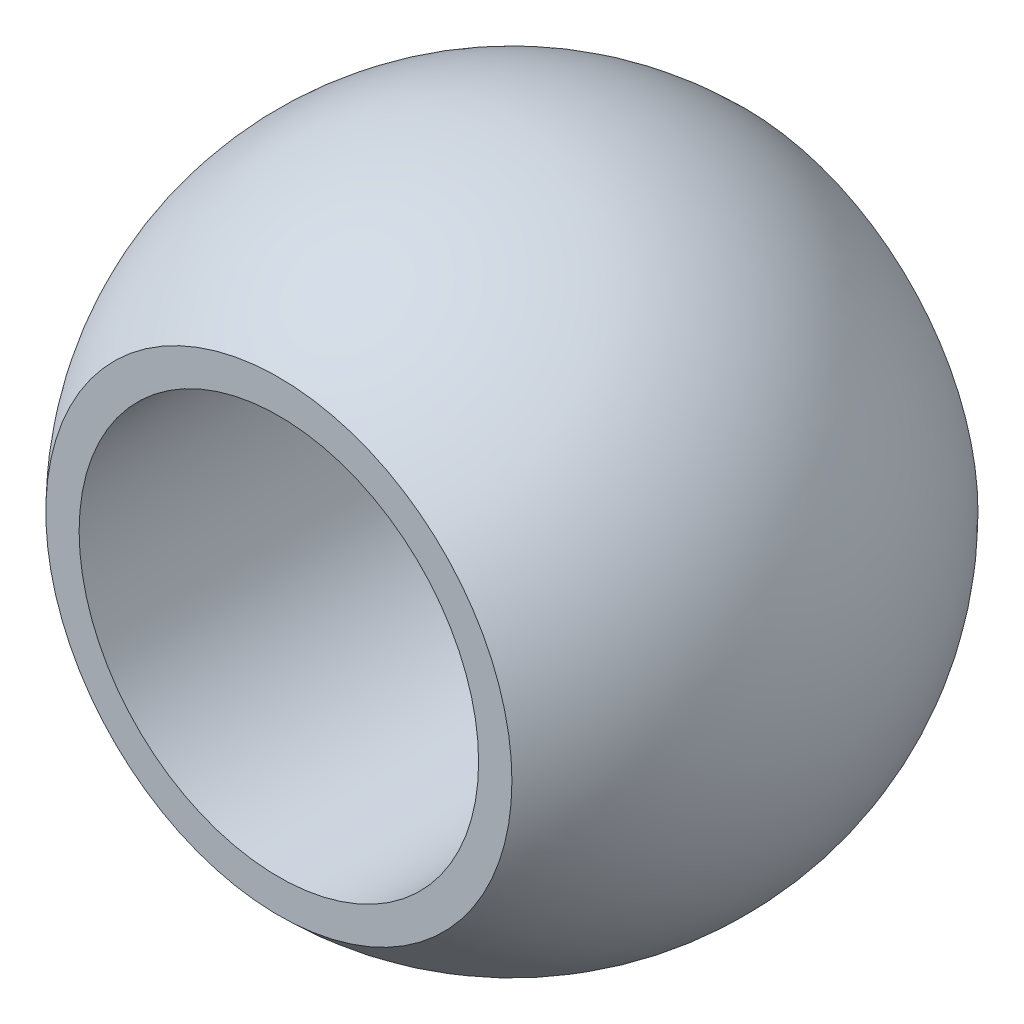
ISO-10303-21;
HEADER;
FILE_DESCRIPTION(('STEP AP214'),'2;1');
FILE_NAME('part.step','',(''),(''),'','','');
FILE_SCHEMA(('AUTOMOTIVE_DESIGN { 1 0 10303 214 1 1 1 1 }'));
ENDSEC;
DATA;
#1=APPLICATION_CONTEXT('core data for automotive mechanical design processes');
#2=APPLICATION_PROTOCOL_DEFINITION('international standard','automotive_design',2000,#1);
#3=PRODUCT_CONTEXT('',#1,'mechanical');
#4=PRODUCT('Part','Part','',(#3));
#5=PRODUCT_RELATED_PRODUCT_CATEGORY('part','',(#4));
#6=PRODUCT_DEFINITION_FORMATION('','',#4);
#7=PRODUCT_DEFINITION_CONTEXT('part definition',#1,'design');
#8=PRODUCT_DEFINITION('design','',#6,#7);
#9=PRODUCT_DEFINITION_SHAPE('','',#8);
#10=(LENGTH_UNIT() NAMED_UNIT(*) SI_UNIT(.MILLI.,.METRE.));
#11=(NAMED_UNIT(*) PLANE_ANGLE_UNIT() SI_UNIT($,.RADIAN.));
#12=(NAMED_UNIT(*) SI_UNIT($,.STERADIAN.) SOLID_ANGLE_UNIT());
#13=UNCERTAINTY_MEASURE_WITH_UNIT(LENGTH_MEASURE(1.E-05),#10,'distance_accuracy_value','');
#14=(GEOMETRIC_REPRESENTATION_CONTEXT(3) GLOBAL_UNCERTAINTY_ASSIGNED_CONTEXT((#13)) GLOBAL_UNIT_ASSIGNED_CONTEXT((#10,
#11,#12)) REPRESENTATION_CONTEXT('',''));
#15=CARTESIAN_POINT('',(0.,0.,0.));
#16=DIRECTION('',(0.,0.,1.));
#17=DIRECTION('',(1.,0.,0.));
#18=AXIS2_PLACEMENT_3D('',#15,#16,#17);
#19=CARTESIAN_POINT('',(0.,0.,22.));
#20=DIRECTION('',(0.,0.,-1.));
#21=DIRECTION('',(-1.,0.,0.));
#22=AXIS2_PLACEMENT_3D('',#19,#20,#21);
#23=CYLINDRICAL_SURFACE('',#22,6.);
#24=CARTESIAN_POINT('',(0.,0.,7.));
#25=DIRECTION('',(0.,0.,1.));
#26=DIRECTION('',(1.,0.,0.));
#27=AXIS2_PLACEMENT_3D('',#24,#25,#26);
#28=CIRCLE('',#27,6.);
#29=CARTESIAN_POINT('',(6.,0.,7.));
#30=VERTEX_POINT('',#29);
#31=EDGE_CURVE('E47',#30,#30,#28,.T.);
#32=ORIENTED_EDGE('',*,*,#31,.T.);
#33=EDGE_LOOP('',(#32));
#34=FACE_BOUND('',#33,.T.);
#35=CARTESIAN_POINT('',(0.,0.,-7.));
#36=DIRECTION('',(0.,0.,-1.));
#37=DIRECTION('',(-1.,0.,0.));
#38=AXIS2_PLACEMENT_3D('',#35,#36,#37);
#39=CIRCLE('',#38,6.);
#40=CARTESIAN_POINT('',(-6.,0.,-7.));
#41=VERTEX_POINT('',#40);
#42=EDGE_CURVE('E37',#41,#41,#39,.T.);
#43=ORIENTED_EDGE('',*,*,#42,.T.);
#44=EDGE_LOOP('',(#43));
#45=FACE_BOUND('',#44,.T.);
#46=ADVANCED_FACE('F33',(#34,#45),#23,.F.);
#47=CARTESIAN_POINT('',(-11.0907639100633,10.,7.));
#48=DIRECTION('',(0.,0.,1.));
#49=DIRECTION('',(1.,0.,0.));
#50=AXIS2_PLACEMENT_3D('',#47,#48,#49);
#51=PLANE('',#50);
#52=ORIENTED_EDGE('',*,*,#31,.F.);
#53=EDGE_LOOP('',(#52));
#54=FACE_BOUND('',#53,.T.);
#55=CARTESIAN_POINT('',(0.,0.,7.));
#56=DIRECTION('',(0.,0.,1.));
#57=DIRECTION('',(1.,0.,0.));
#58=AXIS2_PLACEMENT_3D('',#55,#56,#57);
#59=CIRCLE('',#58,7.00071424927486);
#60=CARTESIAN_POINT('',(7.00071424927486,0.,7.));
#61=VERTEX_POINT('',#60);
#62=EDGE_CURVE('E45',#61,#61,#59,.T.);
#63=ORIENTED_EDGE('',*,*,#62,.T.);
#64=EDGE_LOOP('',(#63));
#65=FACE_BOUND('',#64,.T.);
#66=ADVANCED_FACE('F54',(#54,#65),#51,.T.);
#67=CARTESIAN_POINT('',(-11.0870338386805,10.,-7.));
#68=DIRECTION('',(0.,0.,-1.));
#69=DIRECTION('',(-1.,0.,0.));
#70=AXIS2_PLACEMENT_3D('',#67,#68,#69);
#71=PLANE('',#70);
#72=ORIENTED_EDGE('',*,*,#42,.F.);
#73=EDGE_LOOP('',(#72));
#74=FACE_BOUND('',#73,.T.);
#75=CARTESIAN_POINT('',(0.,0.,-7.));
#76=DIRECTION('',(0.,0.,-1.));
#77=DIRECTION('',(-1.,0.,0.));
#78=AXIS2_PLACEMENT_3D('',#75,#76,#77);
#79=CIRCLE('',#78,7.00071424927486);
#80=CARTESIAN_POINT('',(-7.00071424927486,0.,-7.));
#81=VERTEX_POINT('',#80);
#82=EDGE_CURVE('E10',#81,#81,#79,.T.);
#83=ORIENTED_EDGE('',*,*,#82,.T.);
#84=EDGE_LOOP('',(#83));
#85=FACE_BOUND('',#84,.T.);
#86=ADVANCED_FACE('F58',(#74,#85),#71,.T.);
#87=CARTESIAN_POINT('',(0.,0.,0.));
#88=DIRECTION('',(0.,1.,0.));
#89=DIRECTION('',(1.,0.,0.));
#90=AXIS2_PLACEMENT_3D('',#87,#88,#89);
#91=SPHERICAL_SURFACE('',#90,9.9);
#92=CARTESIAN_POINT('',(0.,0.,0.));
#93=DIRECTION('',(0.,0.,1.));
#94=DIRECTION('',(1.,0.,0.));
#95=AXIS2_PLACEMENT_3D('',#92,#93,#94);
#96=SPHERICAL_SURFACE('',#95,9.9);
#97=ORIENTED_EDGE('',*,*,#62,.F.);
#98=EDGE_LOOP('',(#97));
#99=FACE_BOUND('',#98,.T.);
#100=ORIENTED_EDGE('',*,*,#82,.F.);
#101=EDGE_LOOP('',(#100));
#102=FACE_BOUND('',#101,.T.);
#103=ADVANCED_FACE('F35',(#99,#102),#96,.T.);
#104=CLOSED_SHELL('',(#46,#66,#86,#103));
#105=MANIFOLD_SOLID_BREP('B2',#104);
#106=ADVANCED_BREP_SHAPE_REPRESENTATION('',(#18,#105),#14);
#107=SHAPE_DEFINITION_REPRESENTATION(#9,#106);
ENDSEC;
END-ISO-10303-21;
